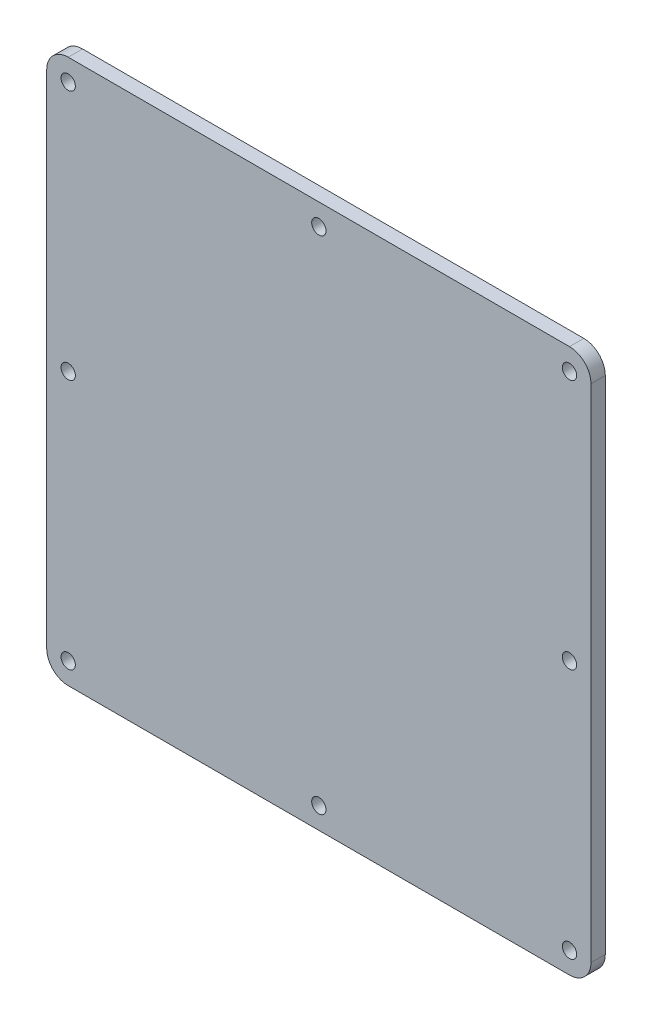
ISO-10303-21;
HEADER;
FILE_DESCRIPTION(('STEP AP214'),'2;1');
FILE_NAME('part.step','',(''),(''),'','','');
FILE_SCHEMA(('AUTOMOTIVE_DESIGN { 1 0 10303 214 1 1 1 1 }'));
ENDSEC;
DATA;
#1=APPLICATION_CONTEXT('core data for automotive mechanical design processes');
#2=APPLICATION_PROTOCOL_DEFINITION('international standard','automotive_design',2000,#1);
#3=PRODUCT_CONTEXT('',#1,'mechanical');
#4=PRODUCT('Part','Part','',(#3));
#5=PRODUCT_RELATED_PRODUCT_CATEGORY('part','',(#4));
#6=PRODUCT_DEFINITION_FORMATION('','',#4);
#7=PRODUCT_DEFINITION_CONTEXT('part definition',#1,'design');
#8=PRODUCT_DEFINITION('design','',#6,#7);
#9=PRODUCT_DEFINITION_SHAPE('','',#8);
#10=(LENGTH_UNIT() NAMED_UNIT(*) SI_UNIT(.MILLI.,.METRE.));
#11=(NAMED_UNIT(*) PLANE_ANGLE_UNIT() SI_UNIT($,.RADIAN.));
#12=(NAMED_UNIT(*) SI_UNIT($,.STERADIAN.) SOLID_ANGLE_UNIT());
#13=UNCERTAINTY_MEASURE_WITH_UNIT(LENGTH_MEASURE(1.E-05),#10,'distance_accuracy_value','');
#14=(GEOMETRIC_REPRESENTATION_CONTEXT(3) GLOBAL_UNCERTAINTY_ASSIGNED_CONTEXT((#13)) GLOBAL_UNIT_ASSIGNED_CONTEXT((#10,
#11,#12)) REPRESENTATION_CONTEXT('',''));
#15=CARTESIAN_POINT('',(0.,0.,0.));
#16=DIRECTION('',(0.,0.,1.));
#17=DIRECTION('',(1.,0.,0.));
#18=AXIS2_PLACEMENT_3D('',#15,#16,#17);
#19=CARTESIAN_POINT('',(-175.,-175.,10.));
#20=DIRECTION('',(0.,0.,1.));
#21=DIRECTION('',(1.,0.,0.));
#22=AXIS2_PLACEMENT_3D('',#19,#20,#21);
#23=PLANE('',#22);
#24=CARTESIAN_POINT('',(0.,-175.,10.));
#25=DIRECTION('',(0.,0.,1.));
#26=DIRECTION('',(1.,0.,0.));
#27=AXIS2_PLACEMENT_3D('',#24,#25,#26);
#28=CIRCLE('',#27,5.);
#29=CARTESIAN_POINT('',(5.,-175.,10.));
#30=VERTEX_POINT('',#29);
#31=EDGE_CURVE('E212',#30,#30,#28,.T.);
#32=ORIENTED_EDGE('',*,*,#31,.F.);
#33=EDGE_LOOP('',(#32));
#34=FACE_BOUND('',#33,.T.);
#35=CARTESIAN_POINT('',(-175.,0.,10.));
#36=DIRECTION('',(0.,0.,1.));
#37=DIRECTION('',(1.,0.,0.));
#38=AXIS2_PLACEMENT_3D('',#35,#36,#37);
#39=CIRCLE('',#38,5.00000000000002);
#40=CARTESIAN_POINT('',(-170.,0.,10.));
#41=VERTEX_POINT('',#40);
#42=EDGE_CURVE('E200',#41,#41,#39,.T.);
#43=ORIENTED_EDGE('',*,*,#42,.F.);
#44=EDGE_LOOP('',(#43));
#45=FACE_BOUND('',#44,.T.);
#46=CARTESIAN_POINT('',(175.,175.,10.));
#47=DIRECTION('',(0.,0.,1.));
#48=DIRECTION('',(1.,0.,0.));
#49=AXIS2_PLACEMENT_3D('',#46,#47,#48);
#50=CIRCLE('',#49,4.99999999999999);
#51=CARTESIAN_POINT('',(180.,175.,10.));
#52=VERTEX_POINT('',#51);
#53=EDGE_CURVE('E188',#52,#52,#50,.T.);
#54=ORIENTED_EDGE('',*,*,#53,.F.);
#55=EDGE_LOOP('',(#54));
#56=FACE_BOUND('',#55,.T.);
#57=CARTESIAN_POINT('',(-175.,175.,10.));
#58=DIRECTION('',(0.,0.,1.));
#59=DIRECTION('',(1.,0.,0.));
#60=AXIS2_PLACEMENT_3D('',#57,#58,#59);
#61=CIRCLE('',#60,4.99999999999999);
#62=CARTESIAN_POINT('',(-170.,175.,10.));
#63=VERTEX_POINT('',#62);
#64=EDGE_CURVE('E134',#63,#63,#61,.T.);
#65=ORIENTED_EDGE('',*,*,#64,.F.);
#66=EDGE_LOOP('',(#65));
#67=FACE_BOUND('',#66,.T.);
#68=CARTESIAN_POINT('',(-175.,-175.,10.));
#69=DIRECTION('',(0.,0.,1.));
#70=DIRECTION('',(1.,0.,0.));
#71=AXIS2_PLACEMENT_3D('',#68,#69,#70);
#72=CIRCLE('',#71,15.);
#73=CARTESIAN_POINT('',(-190.,-175.,10.));
#74=VERTEX_POINT('',#73);
#75=CARTESIAN_POINT('',(-175.,-190.,10.));
#76=VERTEX_POINT('',#75);
#77=EDGE_CURVE('E145',#74,#76,#72,.T.);
#78=ORIENTED_EDGE('',*,*,#77,.T.);
#79=DIRECTION('',(1.,0.,0.));
#80=VECTOR('',#79,1.);
#81=CARTESIAN_POINT('',(-175.,-190.,10.));
#82=LINE('',#81,#80);
#83=CARTESIAN_POINT('',(175.,-190.,10.));
#84=VERTEX_POINT('',#83);
#85=EDGE_CURVE('E93',#76,#84,#82,.T.);
#86=ORIENTED_EDGE('',*,*,#85,.T.);
#87=CARTESIAN_POINT('',(175.,-175.,10.));
#88=DIRECTION('',(0.,0.,1.));
#89=DIRECTION('',(1.,0.,0.));
#90=AXIS2_PLACEMENT_3D('',#87,#88,#89);
#91=CIRCLE('',#90,15.);
#92=CARTESIAN_POINT('',(190.,-175.,10.));
#93=VERTEX_POINT('',#92);
#94=EDGE_CURVE('E160',#84,#93,#91,.T.);
#95=ORIENTED_EDGE('',*,*,#94,.T.);
#96=DIRECTION('',(0.,1.,0.));
#97=VECTOR('',#96,1.);
#98=CARTESIAN_POINT('',(190.,175.,10.));
#99=LINE('',#98,#97);
#100=CARTESIAN_POINT('',(190.,175.,10.));
#101=VERTEX_POINT('',#100);
#102=EDGE_CURVE('E173',#93,#101,#99,.T.);
#103=ORIENTED_EDGE('',*,*,#102,.T.);
#104=CARTESIAN_POINT('',(175.,175.,10.));
#105=DIRECTION('',(0.,0.,1.));
#106=DIRECTION('',(-1.,0.,0.));
#107=AXIS2_PLACEMENT_3D('',#104,#105,#106);
#108=CIRCLE('',#107,15.);
#109=CARTESIAN_POINT('',(175.,190.,10.));
#110=VERTEX_POINT('',#109);
#111=EDGE_CURVE('E112',#101,#110,#108,.T.);
#112=ORIENTED_EDGE('',*,*,#111,.T.);
#113=DIRECTION('',(-1.,0.,0.));
#114=VECTOR('',#113,1.);
#115=CARTESIAN_POINT('',(-175.,190.,10.));
#116=LINE('',#115,#114);
#117=CARTESIAN_POINT('',(-175.,190.,10.));
#118=VERTEX_POINT('',#117);
#119=EDGE_CURVE('E106',#110,#118,#116,.T.);
#120=ORIENTED_EDGE('',*,*,#119,.T.);
#121=CARTESIAN_POINT('',(-175.,175.,10.));
#122=DIRECTION('',(0.,0.,1.));
#123=DIRECTION('',(1.,0.,0.));
#124=AXIS2_PLACEMENT_3D('',#121,#122,#123);
#125=CIRCLE('',#124,15.0000000000001);
#126=CARTESIAN_POINT('',(-190.,175.,10.));
#127=VERTEX_POINT('',#126);
#128=EDGE_CURVE('E110',#118,#127,#125,.T.);
#129=ORIENTED_EDGE('',*,*,#128,.T.);
#130=DIRECTION('',(0.,-1.,0.));
#131=VECTOR('',#130,1.);
#132=CARTESIAN_POINT('',(-190.,175.,10.));
#133=LINE('',#132,#131);
#134=EDGE_CURVE('E50',#127,#74,#133,.T.);
#135=ORIENTED_EDGE('',*,*,#134,.T.);
#136=EDGE_LOOP('',(#78,#86,#95,#103,#112,#120,#129,#135));
#137=FACE_BOUND('',#136,.T.);
#138=CARTESIAN_POINT('',(0.,175.,10.));
#139=DIRECTION('',(0.,0.,1.));
#140=DIRECTION('',(1.,0.,0.));
#141=AXIS2_PLACEMENT_3D('',#138,#139,#140);
#142=CIRCLE('',#141,5.00000000000001);
#143=CARTESIAN_POINT('',(5.00000000000001,175.,10.));
#144=VERTEX_POINT('',#143);
#145=EDGE_CURVE('E182',#144,#144,#142,.T.);
#146=ORIENTED_EDGE('',*,*,#145,.F.);
#147=EDGE_LOOP('',(#146));
#148=FACE_BOUND('',#147,.T.);
#149=CARTESIAN_POINT('',(175.,0.,10.));
#150=DIRECTION('',(0.,0.,1.));
#151=DIRECTION('',(1.,0.,0.));
#152=AXIS2_PLACEMENT_3D('',#149,#150,#151);
#153=CIRCLE('',#152,5.00000000000002);
#154=CARTESIAN_POINT('',(180.,0.,10.));
#155=VERTEX_POINT('',#154);
#156=EDGE_CURVE('E194',#155,#155,#153,.T.);
#157=ORIENTED_EDGE('',*,*,#156,.F.);
#158=EDGE_LOOP('',(#157));
#159=FACE_BOUND('',#158,.T.);
#160=CARTESIAN_POINT('',(-175.,-175.,10.));
#161=DIRECTION('',(0.,0.,1.));
#162=DIRECTION('',(1.,0.,0.));
#163=AXIS2_PLACEMENT_3D('',#160,#161,#162);
#164=CIRCLE('',#163,4.99999999999999);
#165=CARTESIAN_POINT('',(-170.,-175.,10.));
#166=VERTEX_POINT('',#165);
#167=EDGE_CURVE('E206',#166,#166,#164,.T.);
#168=ORIENTED_EDGE('',*,*,#167,.F.);
#169=EDGE_LOOP('',(#168));
#170=FACE_BOUND('',#169,.T.);
#171=CARTESIAN_POINT('',(175.,-175.,10.));
#172=DIRECTION('',(0.,0.,1.));
#173=DIRECTION('',(1.,0.,0.));
#174=AXIS2_PLACEMENT_3D('',#171,#172,#173);
#175=CIRCLE('',#174,4.99999999999999);
#176=CARTESIAN_POINT('',(180.,-175.,10.));
#177=VERTEX_POINT('',#176);
#178=EDGE_CURVE('E218',#177,#177,#175,.T.);
#179=ORIENTED_EDGE('',*,*,#178,.F.);
#180=EDGE_LOOP('',(#179));
#181=FACE_BOUND('',#180,.T.);
#182=ADVANCED_FACE('F33',(#34,#45,#56,#67,#137,#148,#159,#170,#181),#23,.T.);
#183=CARTESIAN_POINT('',(-175.,-175.,0.));
#184=DIRECTION('',(0.,0.,1.));
#185=DIRECTION('',(1.,0.,0.));
#186=AXIS2_PLACEMENT_3D('',#183,#184,#185);
#187=PLANE('',#186);
#188=CARTESIAN_POINT('',(-175.,-175.,0.));
#189=DIRECTION('',(0.,0.,1.));
#190=DIRECTION('',(1.,0.,0.));
#191=AXIS2_PLACEMENT_3D('',#188,#189,#190);
#192=CIRCLE('',#191,15.);
#193=CARTESIAN_POINT('',(-190.,-175.,0.));
#194=VERTEX_POINT('',#193);
#195=CARTESIAN_POINT('',(-175.,-190.,0.));
#196=VERTEX_POINT('',#195);
#197=EDGE_CURVE('E130',#194,#196,#192,.T.);
#198=ORIENTED_EDGE('',*,*,#197,.F.);
#199=DIRECTION('',(0.,-1.,0.));
#200=VECTOR('',#199,1.);
#201=CARTESIAN_POINT('',(-190.,175.,0.));
#202=LINE('',#201,#200);
#203=CARTESIAN_POINT('',(-190.,175.,0.));
#204=VERTEX_POINT('',#203);
#205=EDGE_CURVE('E85',#204,#194,#202,.T.);
#206=ORIENTED_EDGE('',*,*,#205,.F.);
#207=CARTESIAN_POINT('',(-175.,175.,0.));
#208=DIRECTION('',(0.,0.,1.));
#209=DIRECTION('',(1.,0.,0.));
#210=AXIS2_PLACEMENT_3D('',#207,#208,#209);
#211=CIRCLE('',#210,15.0000000000001);
#212=CARTESIAN_POINT('',(-175.,190.,0.));
#213=VERTEX_POINT('',#212);
#214=EDGE_CURVE('E79',#213,#204,#211,.T.);
#215=ORIENTED_EDGE('',*,*,#214,.F.);
#216=DIRECTION('',(-1.,0.,0.));
#217=VECTOR('',#216,1.);
#218=CARTESIAN_POINT('',(-175.,190.,0.));
#219=LINE('',#218,#217);
#220=CARTESIAN_POINT('',(175.,190.,0.));
#221=VERTEX_POINT('',#220);
#222=EDGE_CURVE('E120',#221,#213,#219,.T.);
#223=ORIENTED_EDGE('',*,*,#222,.F.);
#224=CARTESIAN_POINT('',(175.,175.,0.));
#225=DIRECTION('',(0.,0.,1.));
#226=DIRECTION('',(-1.,0.,0.));
#227=AXIS2_PLACEMENT_3D('',#224,#225,#226);
#228=CIRCLE('',#227,15.);
#229=CARTESIAN_POINT('',(190.,175.,0.));
#230=VERTEX_POINT('',#229);
#231=EDGE_CURVE('E140',#230,#221,#228,.T.);
#232=ORIENTED_EDGE('',*,*,#231,.F.);
#233=DIRECTION('',(0.,1.,0.));
#234=VECTOR('',#233,1.);
#235=CARTESIAN_POINT('',(190.,175.,0.));
#236=LINE('',#235,#234);
#237=CARTESIAN_POINT('',(190.,-175.,0.));
#238=VERTEX_POINT('',#237);
#239=EDGE_CURVE('E138',#238,#230,#236,.T.);
#240=ORIENTED_EDGE('',*,*,#239,.F.);
#241=CARTESIAN_POINT('',(175.,-175.,0.));
#242=DIRECTION('',(0.,0.,1.));
#243=DIRECTION('',(1.,0.,0.));
#244=AXIS2_PLACEMENT_3D('',#241,#242,#243);
#245=CIRCLE('',#244,15.);
#246=CARTESIAN_POINT('',(175.,-190.,0.));
#247=VERTEX_POINT('',#246);
#248=EDGE_CURVE('E136',#247,#238,#245,.T.);
#249=ORIENTED_EDGE('',*,*,#248,.F.);
#250=DIRECTION('',(1.,0.,0.));
#251=VECTOR('',#250,1.);
#252=CARTESIAN_POINT('',(-175.,-190.,0.));
#253=LINE('',#252,#251);
#254=EDGE_CURVE('E133',#196,#247,#253,.T.);
#255=ORIENTED_EDGE('',*,*,#254,.F.);
#256=EDGE_LOOP('',(#198,#206,#215,#223,#232,#240,#249,#255));
#257=FACE_BOUND('',#256,.T.);
#258=CARTESIAN_POINT('',(-175.,175.,0.));
#259=DIRECTION('',(0.,0.,1.));
#260=DIRECTION('',(1.,0.,0.));
#261=AXIS2_PLACEMENT_3D('',#258,#259,#260);
#262=CIRCLE('',#261,4.99999999999999);
#263=CARTESIAN_POINT('',(-170.,175.,0.));
#264=VERTEX_POINT('',#263);
#265=EDGE_CURVE('E179',#264,#264,#262,.T.);
#266=ORIENTED_EDGE('',*,*,#265,.T.);
#267=EDGE_LOOP('',(#266));
#268=FACE_BOUND('',#267,.T.);
#269=CARTESIAN_POINT('',(0.,175.,0.));
#270=DIRECTION('',(0.,0.,1.));
#271=DIRECTION('',(1.,0.,0.));
#272=AXIS2_PLACEMENT_3D('',#269,#270,#271);
#273=CIRCLE('',#272,5.00000000000001);
#274=CARTESIAN_POINT('',(5.00000000000001,175.,0.));
#275=VERTEX_POINT('',#274);
#276=EDGE_CURVE('E185',#275,#275,#273,.T.);
#277=ORIENTED_EDGE('',*,*,#276,.T.);
#278=EDGE_LOOP('',(#277));
#279=FACE_BOUND('',#278,.T.);
#280=CARTESIAN_POINT('',(175.,175.,0.));
#281=DIRECTION('',(0.,0.,1.));
#282=DIRECTION('',(1.,0.,0.));
#283=AXIS2_PLACEMENT_3D('',#280,#281,#282);
#284=CIRCLE('',#283,4.99999999999999);
#285=CARTESIAN_POINT('',(180.,175.,0.));
#286=VERTEX_POINT('',#285);
#287=EDGE_CURVE('E191',#286,#286,#284,.T.);
#288=ORIENTED_EDGE('',*,*,#287,.T.);
#289=EDGE_LOOP('',(#288));
#290=FACE_BOUND('',#289,.T.);
#291=CARTESIAN_POINT('',(175.,0.,0.));
#292=DIRECTION('',(0.,0.,1.));
#293=DIRECTION('',(1.,0.,0.));
#294=AXIS2_PLACEMENT_3D('',#291,#292,#293);
#295=CIRCLE('',#294,5.00000000000002);
#296=CARTESIAN_POINT('',(180.,0.,0.));
#297=VERTEX_POINT('',#296);
#298=EDGE_CURVE('E197',#297,#297,#295,.T.);
#299=ORIENTED_EDGE('',*,*,#298,.T.);
#300=EDGE_LOOP('',(#299));
#301=FACE_BOUND('',#300,.T.);
#302=CARTESIAN_POINT('',(-175.,0.,0.));
#303=DIRECTION('',(0.,0.,1.));
#304=DIRECTION('',(1.,0.,0.));
#305=AXIS2_PLACEMENT_3D('',#302,#303,#304);
#306=CIRCLE('',#305,5.00000000000002);
#307=CARTESIAN_POINT('',(-170.,0.,0.));
#308=VERTEX_POINT('',#307);
#309=EDGE_CURVE('E203',#308,#308,#306,.T.);
#310=ORIENTED_EDGE('',*,*,#309,.T.);
#311=EDGE_LOOP('',(#310));
#312=FACE_BOUND('',#311,.T.);
#313=CARTESIAN_POINT('',(-175.,-175.,0.));
#314=DIRECTION('',(0.,0.,1.));
#315=DIRECTION('',(1.,0.,0.));
#316=AXIS2_PLACEMENT_3D('',#313,#314,#315);
#317=CIRCLE('',#316,4.99999999999999);
#318=CARTESIAN_POINT('',(-170.,-175.,0.));
#319=VERTEX_POINT('',#318);
#320=EDGE_CURVE('E209',#319,#319,#317,.T.);
#321=ORIENTED_EDGE('',*,*,#320,.T.);
#322=EDGE_LOOP('',(#321));
#323=FACE_BOUND('',#322,.T.);
#324=CARTESIAN_POINT('',(0.,-175.,0.));
#325=DIRECTION('',(0.,0.,1.));
#326=DIRECTION('',(1.,0.,0.));
#327=AXIS2_PLACEMENT_3D('',#324,#325,#326);
#328=CIRCLE('',#327,5.);
#329=CARTESIAN_POINT('',(5.,-175.,0.));
#330=VERTEX_POINT('',#329);
#331=EDGE_CURVE('E215',#330,#330,#328,.T.);
#332=ORIENTED_EDGE('',*,*,#331,.T.);
#333=EDGE_LOOP('',(#332));
#334=FACE_BOUND('',#333,.T.);
#335=CARTESIAN_POINT('',(175.,-175.,0.));
#336=DIRECTION('',(0.,0.,1.));
#337=DIRECTION('',(1.,0.,0.));
#338=AXIS2_PLACEMENT_3D('',#335,#336,#337);
#339=CIRCLE('',#338,4.99999999999999);
#340=CARTESIAN_POINT('',(180.,-175.,0.));
#341=VERTEX_POINT('',#340);
#342=EDGE_CURVE('E221',#341,#341,#339,.T.);
#343=ORIENTED_EDGE('',*,*,#342,.T.);
#344=EDGE_LOOP('',(#343));
#345=FACE_BOUND('',#344,.T.);
#346=ADVANCED_FACE('F164',(#257,#268,#279,#290,#301,#312,#323,#334,#345),#187,.F.);
#347=CARTESIAN_POINT('',(-175.,-175.,10.));
#348=DIRECTION('',(0.,0.,-1.));
#349=DIRECTION('',(-1.,0.,0.));
#350=AXIS2_PLACEMENT_3D('',#347,#348,#349);
#351=CYLINDRICAL_SURFACE('',#350,15.);
#352=ORIENTED_EDGE('',*,*,#197,.T.);
#353=DIRECTION('',(0.,0.,-1.));
#354=VECTOR('',#353,1.);
#355=CARTESIAN_POINT('',(-175.,-190.,10.));
#356=LINE('',#355,#354);
#357=EDGE_CURVE('E11',#76,#196,#356,.T.);
#358=ORIENTED_EDGE('',*,*,#357,.F.);
#359=ORIENTED_EDGE('',*,*,#77,.F.);
#360=DIRECTION('',(0.,0.,-1.));
#361=VECTOR('',#360,1.);
#362=CARTESIAN_POINT('',(-190.,-175.,10.));
#363=LINE('',#362,#361);
#364=EDGE_CURVE('E126',#74,#194,#363,.T.);
#365=ORIENTED_EDGE('',*,*,#364,.T.);
#366=EDGE_LOOP('',(#352,#358,#359,#365));
#367=FACE_BOUND('',#366,.T.);
#368=ADVANCED_FACE('F35',(#367),#351,.T.);
#369=CARTESIAN_POINT('',(-175.,-190.,10.));
#370=DIRECTION('',(0.,1.,0.));
#371=DIRECTION('',(0.,0.,1.));
#372=AXIS2_PLACEMENT_3D('',#369,#370,#371);
#373=PLANE('',#372);
#374=ORIENTED_EDGE('',*,*,#254,.T.);
#375=DIRECTION('',(0.,0.,-1.));
#376=VECTOR('',#375,1.);
#377=CARTESIAN_POINT('',(175.,-190.,10.));
#378=LINE('',#377,#376);
#379=EDGE_CURVE('E42',#84,#247,#378,.T.);
#380=ORIENTED_EDGE('',*,*,#379,.F.);
#381=ORIENTED_EDGE('',*,*,#85,.F.);
#382=ORIENTED_EDGE('',*,*,#357,.T.);
#383=EDGE_LOOP('',(#374,#380,#381,#382));
#384=FACE_BOUND('',#383,.T.);
#385=ADVANCED_FACE('F255',(#384),#373,.F.);
#386=CARTESIAN_POINT('',(175.,-175.,10.));
#387=DIRECTION('',(0.,0.,-1.));
#388=DIRECTION('',(-1.,0.,0.));
#389=AXIS2_PLACEMENT_3D('',#386,#387,#388);
#390=CYLINDRICAL_SURFACE('',#389,15.);
#391=ORIENTED_EDGE('',*,*,#248,.T.);
#392=DIRECTION('',(0.,0.,-1.));
#393=VECTOR('',#392,1.);
#394=CARTESIAN_POINT('',(190.,-175.,10.));
#395=LINE('',#394,#393);
#396=EDGE_CURVE('E152',#93,#238,#395,.T.);
#397=ORIENTED_EDGE('',*,*,#396,.F.);
#398=ORIENTED_EDGE('',*,*,#94,.F.);
#399=ORIENTED_EDGE('',*,*,#379,.T.);
#400=EDGE_LOOP('',(#391,#397,#398,#399));
#401=FACE_BOUND('',#400,.T.);
#402=ADVANCED_FACE('F158',(#401),#390,.T.);
#403=CARTESIAN_POINT('',(190.,175.,10.));
#404=DIRECTION('',(-1.,0.,0.));
#405=DIRECTION('',(0.,-1.,0.));
#406=AXIS2_PLACEMENT_3D('',#403,#404,#405);
#407=PLANE('',#406);
#408=ORIENTED_EDGE('',*,*,#239,.T.);
#409=DIRECTION('',(0.,0.,-1.));
#410=VECTOR('',#409,1.);
#411=CARTESIAN_POINT('',(190.,175.,10.));
#412=LINE('',#411,#410);
#413=EDGE_CURVE('E149',#101,#230,#412,.T.);
#414=ORIENTED_EDGE('',*,*,#413,.F.);
#415=ORIENTED_EDGE('',*,*,#102,.F.);
#416=ORIENTED_EDGE('',*,*,#396,.T.);
#417=EDGE_LOOP('',(#408,#414,#415,#416));
#418=FACE_BOUND('',#417,.T.);
#419=ADVANCED_FACE('F169',(#418),#407,.F.);
#420=CARTESIAN_POINT('',(175.,175.,10.));
#421=DIRECTION('',(0.,0.,-1.));
#422=DIRECTION('',(-1.,0.,0.));
#423=AXIS2_PLACEMENT_3D('',#420,#421,#422);
#424=CYLINDRICAL_SURFACE('',#423,15.);
#425=ORIENTED_EDGE('',*,*,#231,.T.);
#426=DIRECTION('',(0.,0.,-1.));
#427=VECTOR('',#426,1.);
#428=CARTESIAN_POINT('',(175.,190.,10.));
#429=LINE('',#428,#427);
#430=EDGE_CURVE('E121',#110,#221,#429,.T.);
#431=ORIENTED_EDGE('',*,*,#430,.F.);
#432=ORIENTED_EDGE('',*,*,#111,.F.);
#433=ORIENTED_EDGE('',*,*,#413,.T.);
#434=EDGE_LOOP('',(#425,#431,#432,#433));
#435=FACE_BOUND('',#434,.T.);
#436=ADVANCED_FACE('F172',(#435),#424,.T.);
#437=CARTESIAN_POINT('',(-175.,190.,10.));
#438=DIRECTION('',(0.,-1.,0.));
#439=DIRECTION('',(0.,0.,-1.));
#440=AXIS2_PLACEMENT_3D('',#437,#438,#439);
#441=PLANE('',#440);
#442=ORIENTED_EDGE('',*,*,#222,.T.);
#443=DIRECTION('',(0.,0.,-1.));
#444=VECTOR('',#443,1.);
#445=CARTESIAN_POINT('',(-175.,190.,10.));
#446=LINE('',#445,#444);
#447=EDGE_CURVE('E117',#118,#213,#446,.T.);
#448=ORIENTED_EDGE('',*,*,#447,.F.);
#449=ORIENTED_EDGE('',*,*,#119,.F.);
#450=ORIENTED_EDGE('',*,*,#430,.T.);
#451=EDGE_LOOP('',(#442,#448,#449,#450));
#452=FACE_BOUND('',#451,.T.);
#453=ADVANCED_FACE('F118',(#452),#441,.F.);
#454=CARTESIAN_POINT('',(-175.,175.,10.));
#455=DIRECTION('',(0.,0.,-1.));
#456=DIRECTION('',(-1.,0.,0.));
#457=AXIS2_PLACEMENT_3D('',#454,#455,#456);
#458=CYLINDRICAL_SURFACE('',#457,15.0000000000001);
#459=ORIENTED_EDGE('',*,*,#214,.T.);
#460=DIRECTION('',(0.,0.,-1.));
#461=VECTOR('',#460,1.);
#462=CARTESIAN_POINT('',(-190.,175.,10.));
#463=LINE('',#462,#461);
#464=EDGE_CURVE('E122',#127,#204,#463,.T.);
#465=ORIENTED_EDGE('',*,*,#464,.F.);
#466=ORIENTED_EDGE('',*,*,#128,.F.);
#467=ORIENTED_EDGE('',*,*,#447,.T.);
#468=EDGE_LOOP('',(#459,#465,#466,#467));
#469=FACE_BOUND('',#468,.T.);
#470=ADVANCED_FACE('F124',(#469),#458,.T.);
#471=CARTESIAN_POINT('',(-190.,175.,10.));
#472=DIRECTION('',(1.,0.,0.));
#473=DIRECTION('',(0.,1.,0.));
#474=AXIS2_PLACEMENT_3D('',#471,#472,#473);
#475=PLANE('',#474);
#476=ORIENTED_EDGE('',*,*,#205,.T.);
#477=ORIENTED_EDGE('',*,*,#364,.F.);
#478=ORIENTED_EDGE('',*,*,#134,.F.);
#479=ORIENTED_EDGE('',*,*,#464,.T.);
#480=EDGE_LOOP('',(#476,#477,#478,#479));
#481=FACE_BOUND('',#480,.T.);
#482=ADVANCED_FACE('F243',(#481),#475,.F.);
#483=CARTESIAN_POINT('',(-175.,175.,10.));
#484=DIRECTION('',(0.,0.,-1.));
#485=DIRECTION('',(-1.,0.,0.));
#486=AXIS2_PLACEMENT_3D('',#483,#484,#485);
#487=CYLINDRICAL_SURFACE('',#486,4.99999999999999);
#488=ORIENTED_EDGE('',*,*,#64,.T.);
#489=EDGE_LOOP('',(#488));
#490=FACE_BOUND('',#489,.T.);
#491=ORIENTED_EDGE('',*,*,#265,.F.);
#492=EDGE_LOOP('',(#491));
#493=FACE_BOUND('',#492,.T.);
#494=ADVANCED_FACE('F240',(#490,#493),#487,.F.);
#495=CARTESIAN_POINT('',(0.,175.,10.));
#496=DIRECTION('',(0.,0.,-1.));
#497=DIRECTION('',(-1.,0.,0.));
#498=AXIS2_PLACEMENT_3D('',#495,#496,#497);
#499=CYLINDRICAL_SURFACE('',#498,5.00000000000001);
#500=ORIENTED_EDGE('',*,*,#145,.T.);
#501=EDGE_LOOP('',(#500));
#502=FACE_BOUND('',#501,.T.);
#503=ORIENTED_EDGE('',*,*,#276,.F.);
#504=EDGE_LOOP('',(#503));
#505=FACE_BOUND('',#504,.T.);
#506=ADVANCED_FACE('F319',(#502,#505),#499,.F.);
#507=CARTESIAN_POINT('',(175.,175.,10.));
#508=DIRECTION('',(0.,0.,-1.));
#509=DIRECTION('',(-1.,0.,0.));
#510=AXIS2_PLACEMENT_3D('',#507,#508,#509);
#511=CYLINDRICAL_SURFACE('',#510,4.99999999999999);
#512=ORIENTED_EDGE('',*,*,#53,.T.);
#513=EDGE_LOOP('',(#512));
#514=FACE_BOUND('',#513,.T.);
#515=ORIENTED_EDGE('',*,*,#287,.F.);
#516=EDGE_LOOP('',(#515));
#517=FACE_BOUND('',#516,.T.);
#518=ADVANCED_FACE('F327',(#514,#517),#511,.F.);
#519=CARTESIAN_POINT('',(175.,0.,10.));
#520=DIRECTION('',(0.,0.,-1.));
#521=DIRECTION('',(-1.,0.,0.));
#522=AXIS2_PLACEMENT_3D('',#519,#520,#521);
#523=CYLINDRICAL_SURFACE('',#522,5.00000000000002);
#524=ORIENTED_EDGE('',*,*,#156,.T.);
#525=EDGE_LOOP('',(#524));
#526=FACE_BOUND('',#525,.T.);
#527=ORIENTED_EDGE('',*,*,#298,.F.);
#528=EDGE_LOOP('',(#527));
#529=FACE_BOUND('',#528,.T.);
#530=ADVANCED_FACE('F335',(#526,#529),#523,.F.);
#531=CARTESIAN_POINT('',(-175.,0.,10.));
#532=DIRECTION('',(0.,0.,-1.));
#533=DIRECTION('',(-1.,0.,0.));
#534=AXIS2_PLACEMENT_3D('',#531,#532,#533);
#535=CYLINDRICAL_SURFACE('',#534,5.00000000000002);
#536=ORIENTED_EDGE('',*,*,#42,.T.);
#537=EDGE_LOOP('',(#536));
#538=FACE_BOUND('',#537,.T.);
#539=ORIENTED_EDGE('',*,*,#309,.F.);
#540=EDGE_LOOP('',(#539));
#541=FACE_BOUND('',#540,.T.);
#542=ADVANCED_FACE('F344',(#538,#541),#535,.F.);
#543=CARTESIAN_POINT('',(-175.,-175.,10.));
#544=DIRECTION('',(0.,0.,-1.));
#545=DIRECTION('',(-1.,0.,0.));
#546=AXIS2_PLACEMENT_3D('',#543,#544,#545);
#547=CYLINDRICAL_SURFACE('',#546,4.99999999999999);
#548=ORIENTED_EDGE('',*,*,#167,.T.);
#549=EDGE_LOOP('',(#548));
#550=FACE_BOUND('',#549,.T.);
#551=ORIENTED_EDGE('',*,*,#320,.F.);
#552=EDGE_LOOP('',(#551));
#553=FACE_BOUND('',#552,.T.);
#554=ADVANCED_FACE('F353',(#550,#553),#547,.F.);
#555=CARTESIAN_POINT('',(0.,-175.,10.));
#556=DIRECTION('',(0.,0.,-1.));
#557=DIRECTION('',(-1.,0.,0.));
#558=AXIS2_PLACEMENT_3D('',#555,#556,#557);
#559=CYLINDRICAL_SURFACE('',#558,5.);
#560=ORIENTED_EDGE('',*,*,#31,.T.);
#561=EDGE_LOOP('',(#560));
#562=FACE_BOUND('',#561,.T.);
#563=ORIENTED_EDGE('',*,*,#331,.F.);
#564=EDGE_LOOP('',(#563));
#565=FACE_BOUND('',#564,.T.);
#566=ADVANCED_FACE('F362',(#562,#565),#559,.F.);
#567=CARTESIAN_POINT('',(175.,-175.,10.));
#568=DIRECTION('',(0.,0.,-1.));
#569=DIRECTION('',(-1.,0.,0.));
#570=AXIS2_PLACEMENT_3D('',#567,#568,#569);
#571=CYLINDRICAL_SURFACE('',#570,4.99999999999999);
#572=ORIENTED_EDGE('',*,*,#178,.T.);
#573=EDGE_LOOP('',(#572));
#574=FACE_BOUND('',#573,.T.);
#575=ORIENTED_EDGE('',*,*,#342,.F.);
#576=EDGE_LOOP('',(#575));
#577=FACE_BOUND('',#576,.T.);
#578=ADVANCED_FACE('F227',(#574,#577),#571,.F.);
#579=CLOSED_SHELL('',(#182,#346,#368,#385,#402,#419,#436,#453,#470,#482,#494,#506,#518,#530,
#542,#554,#566,#578));
#580=MANIFOLD_SOLID_BREP('B2',#579);
#581=ADVANCED_BREP_SHAPE_REPRESENTATION('',(#18,#580),#14);
#582=SHAPE_DEFINITION_REPRESENTATION(#9,#581);
ENDSEC;
END-ISO-10303-21;
